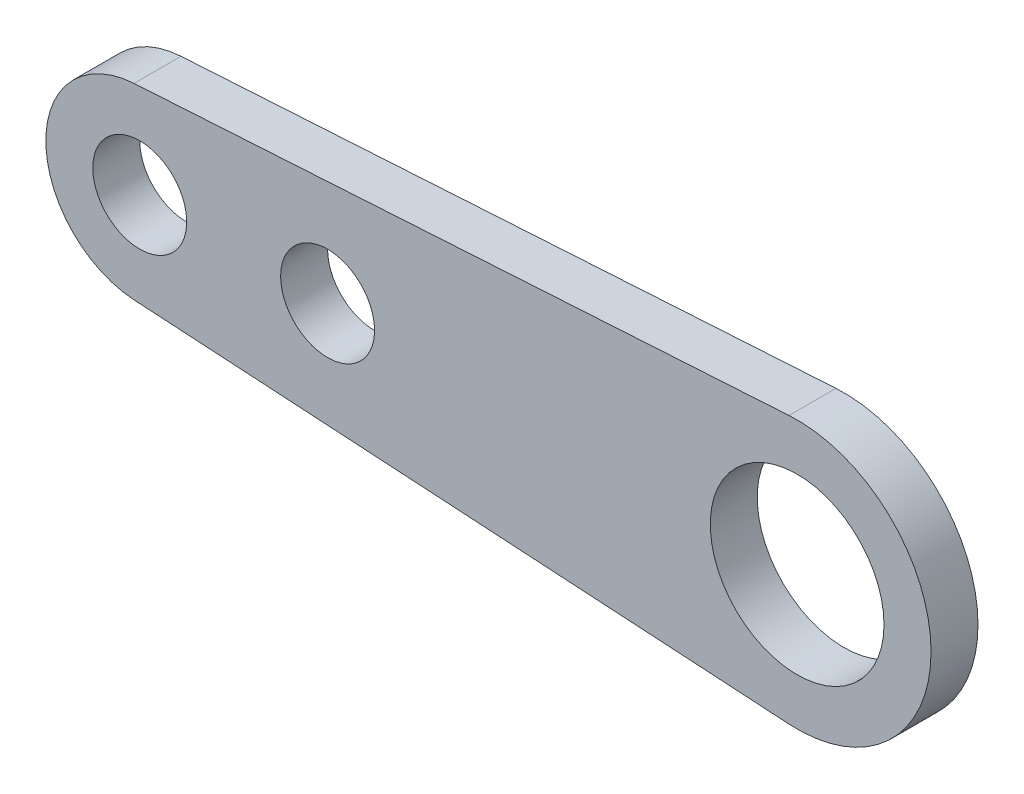
ISO-10303-21;
HEADER;
FILE_DESCRIPTION(('STEP AP214'),'2;1');
FILE_NAME('part.step','',(''),(''),'','','');
FILE_SCHEMA(('AUTOMOTIVE_DESIGN { 1 0 10303 214 1 1 1 1 }'));
ENDSEC;
DATA;
#1=APPLICATION_CONTEXT('core data for automotive mechanical design processes');
#2=APPLICATION_PROTOCOL_DEFINITION('international standard','automotive_design',2000,#1);
#3=PRODUCT_CONTEXT('',#1,'mechanical');
#4=PRODUCT('Part','Part','',(#3));
#5=PRODUCT_RELATED_PRODUCT_CATEGORY('part','',(#4));
#6=PRODUCT_DEFINITION_FORMATION('','',#4);
#7=PRODUCT_DEFINITION_CONTEXT('part definition',#1,'design');
#8=PRODUCT_DEFINITION('design','',#6,#7);
#9=PRODUCT_DEFINITION_SHAPE('','',#8);
#10=(LENGTH_UNIT() NAMED_UNIT(*) SI_UNIT(.MILLI.,.METRE.));
#11=(NAMED_UNIT(*) PLANE_ANGLE_UNIT() SI_UNIT($,.RADIAN.));
#12=(NAMED_UNIT(*) SI_UNIT($,.STERADIAN.) SOLID_ANGLE_UNIT());
#13=UNCERTAINTY_MEASURE_WITH_UNIT(LENGTH_MEASURE(1.E-05),#10,'distance_accuracy_value','');
#14=(GEOMETRIC_REPRESENTATION_CONTEXT(3) GLOBAL_UNCERTAINTY_ASSIGNED_CONTEXT((#13)) GLOBAL_UNIT_ASSIGNED_CONTEXT((#10,
#11,#12)) REPRESENTATION_CONTEXT('',''));
#15=CARTESIAN_POINT('',(0.,0.,0.));
#16=DIRECTION('',(0.,0.,1.));
#17=DIRECTION('',(1.,0.,0.));
#18=AXIS2_PLACEMENT_3D('',#15,#16,#17);
#19=CARTESIAN_POINT('',(-169.731385989756,-19.96297358812,10.));
#20=DIRECTION('',(0.0608211624359725,0.998148679405998,0.));
#21=DIRECTION('',(-0.998148679405998,0.0608211624359725,0.));
#22=AXIS2_PLACEMENT_3D('',#19,#20,#21);
#23=PLANE('',#22);
#24=DIRECTION('',(0.998148679405998,-0.0608211624359725,0.));
#25=VECTOR('',#24,1.);
#26=CARTESIAN_POINT('',(-169.731385989756,-19.96297358812,0.));
#27=LINE('',#26,#25);
#28=CARTESIAN_POINT('',(-169.731385989756,-19.96297358812,0.));
#29=VERTEX_POINT('',#28);
#30=CARTESIAN_POINT('',(-30.2492759217644,-28.4621724032765,0.));
#31=VERTEX_POINT('',#30);
#32=EDGE_CURVE('E87',#29,#31,#27,.T.);
#33=ORIENTED_EDGE('',*,*,#32,.T.);
#34=DIRECTION('',(0.,0.,-1.));
#35=VECTOR('',#34,1.);
#36=CARTESIAN_POINT('',(-30.2492759217644,-28.4621724032765,10.));
#37=LINE('',#36,#35);
#38=CARTESIAN_POINT('',(-30.2492759217644,-28.4621724032765,10.));
#39=VERTEX_POINT('',#38);
#40=EDGE_CURVE('E11',#39,#31,#37,.T.);
#41=ORIENTED_EDGE('',*,*,#40,.F.);
#42=DIRECTION('',(0.998148679405998,-0.0608211624359725,0.));
#43=VECTOR('',#42,1.);
#44=CARTESIAN_POINT('',(-169.731385989756,-19.96297358812,10.));
#45=LINE('',#44,#43);
#46=CARTESIAN_POINT('',(-169.731385989756,-19.96297358812,10.));
#47=VERTEX_POINT('',#46);
#48=EDGE_CURVE('E105',#47,#39,#45,.T.);
#49=ORIENTED_EDGE('',*,*,#48,.F.);
#50=DIRECTION('',(0.,0.,-1.));
#51=VECTOR('',#50,1.);
#52=CARTESIAN_POINT('',(-169.731385989756,-19.96297358812,10.));
#53=LINE('',#52,#51);
#54=EDGE_CURVE('E47',#47,#29,#53,.T.);
#55=ORIENTED_EDGE('',*,*,#54,.T.);
#56=EDGE_LOOP('',(#33,#41,#49,#55));
#57=FACE_BOUND('',#56,.T.);
#58=ADVANCED_FACE('F39',(#57),#23,.F.);
#59=CARTESIAN_POINT('',(-28.5149627410362,0.,10.));
#60=DIRECTION('',(0.,0.,-1.));
#61=DIRECTION('',(-1.,0.,0.));
#62=AXIS2_PLACEMENT_3D('',#59,#60,#61);
#63=CYLINDRICAL_SURFACE('',#62,28.5149627410362);
#64=CARTESIAN_POINT('',(-28.5149627410362,0.,0.));
#65=DIRECTION('',(0.,0.,1.));
#66=DIRECTION('',(1.,0.,0.));
#67=AXIS2_PLACEMENT_3D('',#64,#65,#66);
#68=CIRCLE('',#67,28.5149627410362);
#69=CARTESIAN_POINT('',(-30.2492759217644,28.4621724032765,0.));
#70=VERTEX_POINT('',#69);
#71=EDGE_CURVE('E67',#31,#70,#68,.T.);
#72=ORIENTED_EDGE('',*,*,#71,.T.);
#73=DIRECTION('',(0.,0.,-1.));
#74=VECTOR('',#73,1.);
#75=CARTESIAN_POINT('',(-30.2492759217644,28.4621724032765,10.));
#76=LINE('',#75,#74);
#77=CARTESIAN_POINT('',(-30.2492759217644,28.4621724032765,10.));
#78=VERTEX_POINT('',#77);
#79=EDGE_CURVE('E82',#78,#70,#76,.T.);
#80=ORIENTED_EDGE('',*,*,#79,.F.);
#81=CARTESIAN_POINT('',(-28.5149627410362,0.,10.));
#82=DIRECTION('',(0.,0.,1.));
#83=DIRECTION('',(1.,0.,0.));
#84=AXIS2_PLACEMENT_3D('',#81,#82,#83);
#85=CIRCLE('',#84,28.5149627410362);
#86=EDGE_CURVE('E72',#39,#78,#85,.T.);
#87=ORIENTED_EDGE('',*,*,#86,.F.);
#88=ORIENTED_EDGE('',*,*,#40,.T.);
#89=EDGE_LOOP('',(#72,#80,#87,#88));
#90=FACE_BOUND('',#89,.T.);
#91=ADVANCED_FACE('F81',(#90),#63,.T.);
#92=CARTESIAN_POINT('',(-28.5149627410362,0.,10.));
#93=DIRECTION('',(0.,0.,-1.));
#94=DIRECTION('',(-1.,0.,0.));
#95=AXIS2_PLACEMENT_3D('',#92,#93,#94);
#96=CYLINDRICAL_SURFACE('',#95,18.5);
#97=CARTESIAN_POINT('',(-28.5149627410362,0.,0.));
#98=DIRECTION('',(0.,0.,1.));
#99=DIRECTION('',(1.,0.,0.));
#100=AXIS2_PLACEMENT_3D('',#97,#98,#99);
#101=CIRCLE('',#100,18.5);
#102=CARTESIAN_POINT('',(-10.0149627410362,0.,0.));
#103=VERTEX_POINT('',#102);
#104=EDGE_CURVE('E86',#103,#103,#101,.T.);
#105=ORIENTED_EDGE('',*,*,#104,.F.);
#106=EDGE_LOOP('',(#105));
#107=FACE_BOUND('',#106,.T.);
#108=CARTESIAN_POINT('',(-28.5149627410362,0.,10.));
#109=DIRECTION('',(0.,0.,1.));
#110=DIRECTION('',(1.,0.,0.));
#111=AXIS2_PLACEMENT_3D('',#108,#109,#110);
#112=CIRCLE('',#111,18.5);
#113=CARTESIAN_POINT('',(-10.0149627410362,0.,10.));
#114=VERTEX_POINT('',#113);
#115=EDGE_CURVE('E108',#114,#114,#112,.T.);
#116=ORIENTED_EDGE('',*,*,#115,.T.);
#117=EDGE_LOOP('',(#116));
#118=FACE_BOUND('',#117,.T.);
#119=ADVANCED_FACE('F141',(#107,#118),#96,.F.);
#120=CARTESIAN_POINT('',(-128.514962741036,0.,10.));
#121=DIRECTION('',(0.,0.,-1.));
#122=DIRECTION('',(-1.,0.,0.));
#123=AXIS2_PLACEMENT_3D('',#120,#121,#122);
#124=CYLINDRICAL_SURFACE('',#123,10.);
#125=CARTESIAN_POINT('',(-128.514962741036,0.,0.));
#126=DIRECTION('',(0.,0.,-1.));
#127=DIRECTION('',(-1.,0.,0.));
#128=AXIS2_PLACEMENT_3D('',#125,#126,#127);
#129=CIRCLE('',#128,10.);
#130=CARTESIAN_POINT('',(-138.514962741036,0.,0.));
#131=VERTEX_POINT('',#130);
#132=EDGE_CURVE('E121',#131,#131,#129,.T.);
#133=ORIENTED_EDGE('',*,*,#132,.T.);
#134=EDGE_LOOP('',(#133));
#135=FACE_BOUND('',#134,.T.);
#136=CARTESIAN_POINT('',(-128.514962741036,0.,10.));
#137=DIRECTION('',(0.,0.,-1.));
#138=DIRECTION('',(-1.,0.,0.));
#139=AXIS2_PLACEMENT_3D('',#136,#137,#138);
#140=CIRCLE('',#139,10.);
#141=CARTESIAN_POINT('',(-138.514962741036,0.,10.));
#142=VERTEX_POINT('',#141);
#143=EDGE_CURVE('E111',#142,#142,#140,.T.);
#144=ORIENTED_EDGE('',*,*,#143,.F.);
#145=EDGE_LOOP('',(#144));
#146=FACE_BOUND('',#145,.T.);
#147=ADVANCED_FACE('F143',(#135,#146),#124,.F.);
#148=CARTESIAN_POINT('',(-168.514962741036,0.,10.));
#149=DIRECTION('',(0.,0.,-1.));
#150=DIRECTION('',(-1.,0.,0.));
#151=AXIS2_PLACEMENT_3D('',#148,#149,#150);
#152=CYLINDRICAL_SURFACE('',#151,10.);
#153=CARTESIAN_POINT('',(-168.514962741036,0.,0.));
#154=DIRECTION('',(0.,0.,-1.));
#155=DIRECTION('',(-1.,0.,0.));
#156=AXIS2_PLACEMENT_3D('',#153,#154,#155);
#157=CIRCLE('',#156,10.);
#158=CARTESIAN_POINT('',(-178.514962741036,0.,0.));
#159=VERTEX_POINT('',#158);
#160=EDGE_CURVE('E124',#159,#159,#157,.T.);
#161=ORIENTED_EDGE('',*,*,#160,.T.);
#162=EDGE_LOOP('',(#161));
#163=FACE_BOUND('',#162,.T.);
#164=CARTESIAN_POINT('',(-168.514962741036,0.,10.));
#165=DIRECTION('',(0.,0.,-1.));
#166=DIRECTION('',(-1.,0.,0.));
#167=AXIS2_PLACEMENT_3D('',#164,#165,#166);
#168=CIRCLE('',#167,10.);
#169=CARTESIAN_POINT('',(-178.514962741036,0.,10.));
#170=VERTEX_POINT('',#169);
#171=EDGE_CURVE('E114',#170,#170,#168,.T.);
#172=ORIENTED_EDGE('',*,*,#171,.F.);
#173=EDGE_LOOP('',(#172));
#174=FACE_BOUND('',#173,.T.);
#175=ADVANCED_FACE('F150',(#163,#174),#152,.F.);
#176=CARTESIAN_POINT('',(-168.514962741036,0.,10.));
#177=DIRECTION('',(0.,0.,-1.));
#178=DIRECTION('',(-1.,0.,0.));
#179=AXIS2_PLACEMENT_3D('',#176,#177,#178);
#180=CYLINDRICAL_SURFACE('',#179,20.);
#181=CARTESIAN_POINT('',(-168.514962741036,0.,0.));
#182=DIRECTION('',(0.,0.,1.));
#183=DIRECTION('',(1.,0.,0.));
#184=AXIS2_PLACEMENT_3D('',#181,#182,#183);
#185=CIRCLE('',#184,20.);
#186=CARTESIAN_POINT('',(-169.731385989756,19.96297358812,0.));
#187=VERTEX_POINT('',#186);
#188=EDGE_CURVE('E99',#187,#29,#185,.T.);
#189=ORIENTED_EDGE('',*,*,#188,.T.);
#190=ORIENTED_EDGE('',*,*,#54,.F.);
#191=CARTESIAN_POINT('',(-168.514962741036,0.,10.));
#192=DIRECTION('',(0.,0.,1.));
#193=DIRECTION('',(1.,0.,0.));
#194=AXIS2_PLACEMENT_3D('',#191,#192,#193);
#195=CIRCLE('',#194,20.);
#196=CARTESIAN_POINT('',(-169.731385989756,19.96297358812,10.));
#197=VERTEX_POINT('',#196);
#198=EDGE_CURVE('E55',#197,#47,#195,.T.);
#199=ORIENTED_EDGE('',*,*,#198,.F.);
#200=DIRECTION('',(0.,0.,-1.));
#201=VECTOR('',#200,1.);
#202=CARTESIAN_POINT('',(-169.731385989756,19.96297358812,10.));
#203=LINE('',#202,#201);
#204=EDGE_CURVE('E95',#197,#187,#203,.T.);
#205=ORIENTED_EDGE('',*,*,#204,.T.);
#206=EDGE_LOOP('',(#189,#190,#199,#205));
#207=FACE_BOUND('',#206,.T.);
#208=ADVANCED_FACE('F131',(#207),#180,.T.);
#209=CARTESIAN_POINT('',(-28.5149627410362,0.,10.));
#210=DIRECTION('',(0.,0.,1.));
#211=DIRECTION('',(1.,0.,0.));
#212=AXIS2_PLACEMENT_3D('',#209,#210,#211);
#213=PLANE('',#212);
#214=ORIENTED_EDGE('',*,*,#171,.T.);
#215=EDGE_LOOP('',(#214));
#216=FACE_BOUND('',#215,.T.);
#217=DIRECTION('',(0.998148679405998,0.0608211624359725,0.));
#218=VECTOR('',#217,1.);
#219=CARTESIAN_POINT('',(-169.731385989756,19.96297358812,10.));
#220=LINE('',#219,#218);
#221=EDGE_CURVE('E94',#197,#78,#220,.T.);
#222=ORIENTED_EDGE('',*,*,#221,.F.);
#223=ORIENTED_EDGE('',*,*,#198,.T.);
#224=ORIENTED_EDGE('',*,*,#48,.T.);
#225=ORIENTED_EDGE('',*,*,#86,.T.);
#226=EDGE_LOOP('',(#222,#223,#224,#225));
#227=FACE_BOUND('',#226,.T.);
#228=ORIENTED_EDGE('',*,*,#143,.T.);
#229=EDGE_LOOP('',(#228));
#230=FACE_BOUND('',#229,.T.);
#231=ORIENTED_EDGE('',*,*,#115,.F.);
#232=EDGE_LOOP('',(#231));
#233=FACE_BOUND('',#232,.T.);
#234=ADVANCED_FACE('F132',(#216,#227,#230,#233),#213,.T.);
#235=CARTESIAN_POINT('',(-28.5149627410362,0.,0.));
#236=DIRECTION('',(0.,0.,1.));
#237=DIRECTION('',(1.,0.,0.));
#238=AXIS2_PLACEMENT_3D('',#235,#236,#237);
#239=PLANE('',#238);
#240=ORIENTED_EDGE('',*,*,#160,.F.);
#241=EDGE_LOOP('',(#240));
#242=FACE_BOUND('',#241,.T.);
#243=ORIENTED_EDGE('',*,*,#188,.F.);
#244=DIRECTION('',(0.998148679405998,0.0608211624359725,0.));
#245=VECTOR('',#244,1.);
#246=CARTESIAN_POINT('',(-169.731385989756,19.96297358812,0.));
#247=LINE('',#246,#245);
#248=EDGE_CURVE('E93',#187,#70,#247,.T.);
#249=ORIENTED_EDGE('',*,*,#248,.T.);
#250=ORIENTED_EDGE('',*,*,#71,.F.);
#251=ORIENTED_EDGE('',*,*,#32,.F.);
#252=EDGE_LOOP('',(#243,#249,#250,#251));
#253=FACE_BOUND('',#252,.T.);
#254=ORIENTED_EDGE('',*,*,#132,.F.);
#255=EDGE_LOOP('',(#254));
#256=FACE_BOUND('',#255,.T.);
#257=ORIENTED_EDGE('',*,*,#104,.T.);
#258=EDGE_LOOP('',(#257));
#259=FACE_BOUND('',#258,.T.);
#260=ADVANCED_FACE('F97',(#242,#253,#256,#259),#239,.F.);
#261=CARTESIAN_POINT('',(-169.731385989756,19.96297358812,10.));
#262=DIRECTION('',(-0.0608211624359725,0.998148679405998,0.));
#263=DIRECTION('',(-0.998148679405998,-0.0608211624359725,0.));
#264=AXIS2_PLACEMENT_3D('',#261,#262,#263);
#265=PLANE('',#264);
#266=ORIENTED_EDGE('',*,*,#248,.F.);
#267=ORIENTED_EDGE('',*,*,#204,.F.);
#268=ORIENTED_EDGE('',*,*,#221,.T.);
#269=ORIENTED_EDGE('',*,*,#79,.T.);
#270=EDGE_LOOP('',(#266,#267,#268,#269));
#271=FACE_BOUND('',#270,.T.);
#272=ADVANCED_FACE('F91',(#271),#265,.T.);
#273=CLOSED_SHELL('',(#58,#91,#119,#147,#175,#208,#234,#260,#272));
#274=MANIFOLD_SOLID_BREP('B2',#273);
#275=ADVANCED_BREP_SHAPE_REPRESENTATION('',(#18,#274),#14);
#276=SHAPE_DEFINITION_REPRESENTATION(#9,#275);
ENDSEC;
END-ISO-10303-21;
